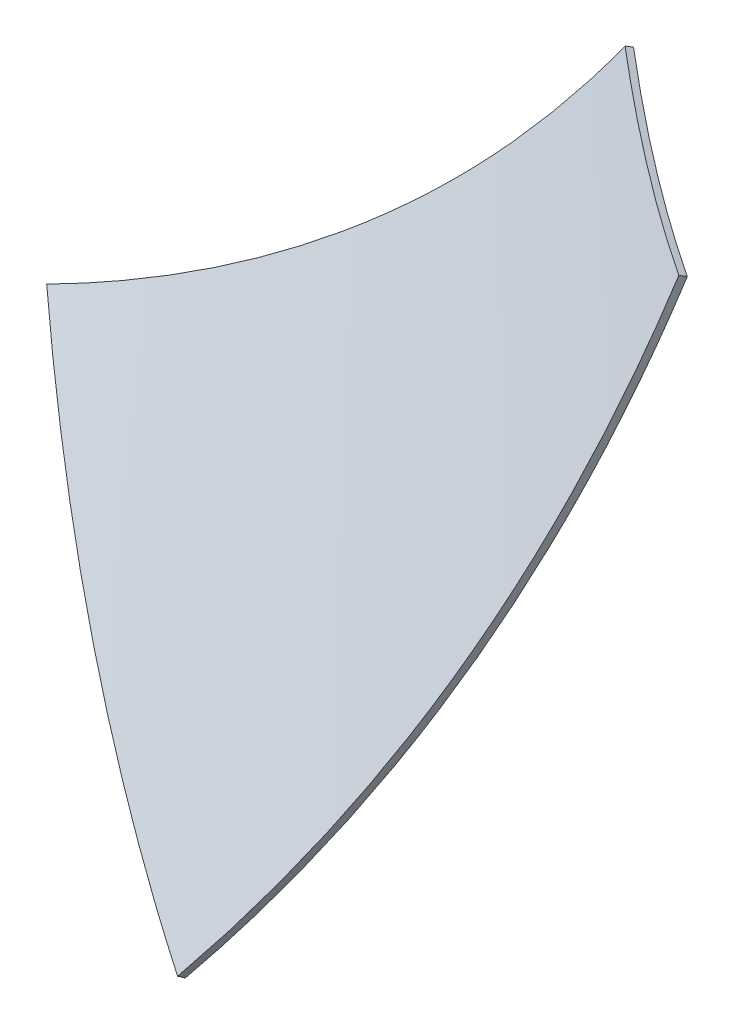
ISO-10303-21;
HEADER;
FILE_DESCRIPTION(('STEP AP214'),'2;1');
FILE_NAME('part.step','',(''),(''),'','','');
FILE_SCHEMA(('AUTOMOTIVE_DESIGN { 1 0 10303 214 1 1 1 1 }'));
ENDSEC;
DATA;
#1=APPLICATION_CONTEXT('core data for automotive mechanical design processes');
#2=APPLICATION_PROTOCOL_DEFINITION('international standard','automotive_design',2000,#1);
#3=PRODUCT_CONTEXT('',#1,'mechanical');
#4=PRODUCT('Part','Part','',(#3));
#5=PRODUCT_RELATED_PRODUCT_CATEGORY('part','',(#4));
#6=PRODUCT_DEFINITION_FORMATION('','',#4);
#7=PRODUCT_DEFINITION_CONTEXT('part definition',#1,'design');
#8=PRODUCT_DEFINITION('design','',#6,#7);
#9=PRODUCT_DEFINITION_SHAPE('','',#8);
#10=(LENGTH_UNIT() NAMED_UNIT(*) SI_UNIT(.MILLI.,.METRE.));
#11=(NAMED_UNIT(*) PLANE_ANGLE_UNIT() SI_UNIT($,.RADIAN.));
#12=(NAMED_UNIT(*) SI_UNIT($,.STERADIAN.) SOLID_ANGLE_UNIT());
#13=UNCERTAINTY_MEASURE_WITH_UNIT(LENGTH_MEASURE(1.E-05),#10,'distance_accuracy_value','');
#14=(GEOMETRIC_REPRESENTATION_CONTEXT(3) GLOBAL_UNCERTAINTY_ASSIGNED_CONTEXT((#13)) GLOBAL_UNIT_ASSIGNED_CONTEXT((#10,
#11,#12)) REPRESENTATION_CONTEXT('',''));
#15=CARTESIAN_POINT('',(0.,0.,0.));
#16=DIRECTION('',(0.,0.,1.));
#17=DIRECTION('',(1.,0.,0.));
#18=AXIS2_PLACEMENT_3D('',#15,#16,#17);
#19=CARTESIAN_POINT('',(79.3770620693268,-120.457408696186,-2.70380006520977));
#20=DIRECTION('',(0.,0.,1.));
#21=DIRECTION('',(1.,0.,0.));
#22=AXIS2_PLACEMENT_3D('',#19,#20,#21);
#23=CONICAL_SURFACE('',#22,60.5897364806192,0.959931088596881);
#24=CARTESIAN_POINT('',(113.763081469682,-170.252399378525,-2.75685890943693));
#25=CARTESIAN_POINT('',(113.8430518673,-170.147553226222,-2.78545030829985));
#26=CARTESIAN_POINT('',(113.922638237613,-170.042424118903,-2.81408465073563));
#27=CARTESIAN_POINT('',(114.318672246614,-169.515340807352,-2.95747724998606));
#28=CARTESIAN_POINT('',(114.629336126704,-169.089190989341,-3.07286604267168));
#29=CARTESIAN_POINT('',(115.238135589453,-168.228364243198,-3.3048713136112));
#30=CARTESIAN_POINT('',(115.536271185896,-167.793687324448,-3.42148779051405));
#31=CARTESIAN_POINT('',(115.973913326075,-167.135596549584,-3.59725895521188));
#32=CARTESIAN_POINT('',(116.118195312454,-166.915228694699,-3.6559882199329));
#33=CARTESIAN_POINT('',(116.546266363469,-166.251090055909,-3.83260339336913));
#34=CARTESIAN_POINT('',(116.825258571065,-165.804316200761,-3.950908096242));
#35=CARTESIAN_POINT('',(117.233941283471,-165.128499931806,-4.12913846131918));
#36=CARTESIAN_POINT('',(117.368529812045,-164.902293695322,-4.1886752614484));
#37=CARTESIAN_POINT('',(117.76739300747,-164.220839546473,-4.36768415576944));
#38=CARTESIAN_POINT('',(118.026744646978,-163.762789241636,-4.48754599459793));
#39=CARTESIAN_POINT('',(118.405698387934,-163.07045794629,-4.66807117115203));
#40=CARTESIAN_POINT('',(118.530332938172,-162.83881351394,-4.72836606275916));
#41=CARTESIAN_POINT('',(118.899179733259,-162.141243595915,-4.90963903164382));
#42=CARTESIAN_POINT('',(119.138315721323,-161.672715747896,-5.03099644120889));
#43=CARTESIAN_POINT('',(119.602887158708,-160.729161916329,-5.2746170729663));
#44=CARTESIAN_POINT('',(119.82832262377,-160.254135940249,-5.39688029411775));
#45=CARTESIAN_POINT('',(120.265424442291,-159.297987378551,-5.64218386217166));
#46=CARTESIAN_POINT('',(120.477090810951,-158.816864799666,-5.76522420821601));
#47=CARTESIAN_POINT('',(120.886544500777,-157.848921516904,-6.01197684195802));
#48=CARTESIAN_POINT('',(121.084331831752,-157.362100817056,-6.1356891291807));
#49=CARTESIAN_POINT('',(121.465908634434,-156.383150548121,-6.38369279603589));
#50=CARTESIAN_POINT('',(121.649698110666,-155.891020980752,-6.50798417548113));
#51=CARTESIAN_POINT('',(122.003141847253,-154.901836426581,-6.75706932986693));
#52=CARTESIAN_POINT('',(122.172796106906,-154.404781439534,-6.88186310483245));
#53=CARTESIAN_POINT('',(122.497815933465,-153.406134318472,-7.13188715657969));
#54=CARTESIAN_POINT('',(122.653181494433,-152.90454218257,-7.25711743354279));
#55=CARTESIAN_POINT('',(123.042825399305,-151.579703796055,-7.58703760967359));
#56=CARTESIAN_POINT('',(123.265115856756,-150.752999236604,-7.79205746416147));
#57=CARTESIAN_POINT('',(123.467814965555,-149.921541777585,-7.99752302693609));
#58=B_SPLINE_CURVE_WITH_KNOTS('',3,(#24,#25,#26,#27,#28,#29,#30,#31,#32,#33,#34,#35,#36,#37,#38,
#39,#40,#41,#42,#43,#44,#45,#46,#47,#48,#49,#50,#51,#52,#53,#54,#55,#56,#57),.UNSPECIFIED.,.F.,
.F.,(4,2,2,2,2,2,2,2,2,2,2,2,2,2,2,2,4),(0.,0.404785694458848,2.02408022212782,3.64337296798241,
4.45295916654202,6.0722507598128,6.88183693229789,8.50112903475456,9.31071537887729,
10.9300091596147,12.5493010798563,14.1685912123174,15.7878802002389,17.4071686645632,
19.026457209355,20.645746427124,23.2857190585913),.UNSPECIFIED.);
#59=CARTESIAN_POINT('',(113.763081469682,-170.252399378525,-2.75685890943708));
#60=VERTEX_POINT('',#59);
#61=CARTESIAN_POINT('',(123.467814965555,-149.921541777585,-7.99752302693618));
#62=VERTEX_POINT('',#61);
#63=EDGE_CURVE('E24',#60,#62,#58,.T.);
#64=ORIENTED_EDGE('',*,*,#63,.T.);
#65=CARTESIAN_POINT('',(123.467814965555,-149.921541777585,-7.99752302693669));
#66=CARTESIAN_POINT('',(123.353900189966,-149.909842691241,-8.06839270908305));
#67=CARTESIAN_POINT('',(123.240281264311,-149.896828156965,-8.1395459575311));
#68=CARTESIAN_POINT('',(122.67345000736,-149.825244410873,-8.49686090490802));
#69=CARTESIAN_POINT('',(122.225035982832,-149.747237864084,-8.78704423252765));
#70=CARTESIAN_POINT('',(121.524058540002,-149.592776207494,-9.25266430869062));
#71=CARTESIAN_POINT('',(121.267148956523,-149.529005516926,-9.42595602925684));
#72=CARTESIAN_POINT('',(120.904386257253,-149.42887855706,-9.67445744911162));
#73=CARTESIAN_POINT('',(120.796500405364,-149.397806276243,-9.74885104371593));
#74=CARTESIAN_POINT('',(120.31886010103,-149.254501487771,-10.0804026850163));
#75=CARTESIAN_POINT('',(119.954072479417,-149.129660688819,-10.3394946224093));
#76=CARTESIAN_POINT('',(119.491680140605,-148.951496900892,-10.6757424971138));
#77=CARTESIAN_POINT('',(119.388219086343,-148.910309152605,-10.7514987942416));
#78=CARTESIAN_POINT('',(118.937843595953,-148.72518493385,-11.0835807574499));
#79=CARTESIAN_POINT('',(118.596666951652,-148.569677711871,-11.341189489594));
#80=CARTESIAN_POINT('',(118.262288373812,-148.401613411912,-11.5999996128499));
#81=B_SPLINE_CURVE_WITH_KNOTS('',3,(#65,#66,#67,#68,#69,#70,#71,#72,#73,#74,#75,#76,#77,#78,#79,
#80),.UNSPECIFIED.,.F.,.F.,(4,2,2,2,2,2,2,4),(0.,0.40403996720341,2.02138933714337,
2.97026784667439,3.37430460638573,4.76665393129968,5.17069019074733,6.53488990231716),.UNSPECIFIED.);
#82=CARTESIAN_POINT('',(118.262288371748,-148.401613410875,-11.5999996144474));
#83=VERTEX_POINT('',#82);
#84=EDGE_CURVE('E119',#62,#83,#81,.T.);
#85=ORIENTED_EDGE('',*,*,#84,.T.);
#86=CARTESIAN_POINT('',(118.262288370097,-148.401613409262,-11.5999996160449));
#87=CARTESIAN_POINT('',(118.182753887889,-148.512288278072,-11.599999649466));
#88=CARTESIAN_POINT('',(118.102739475037,-148.622621200166,-11.6000047399863));
#89=CARTESIAN_POINT('',(117.700242607818,-149.172616884433,-11.6000530761269));
#90=CARTESIAN_POINT('',(117.37061825379,-149.607087354564,-11.6001649766074));
#91=CARTESIAN_POINT('',(116.696639461989,-150.464425619229,-11.6004735845135));
#92=CARTESIAN_POINT('',(116.352285043638,-150.88729342906,-11.6006702918273));
#93=CARTESIAN_POINT('',(115.649296872419,-151.720993623201,-11.6010958966155));
#94=CARTESIAN_POINT('',(115.290663135412,-152.13182602088,-11.6013247940541));
#95=CARTESIAN_POINT('',(114.559588570082,-152.941008315852,-11.6017712994756));
#96=CARTESIAN_POINT('',(114.187147754107,-153.339358224309,-11.6019889074686));
#97=CARTESIAN_POINT('',(113.428912531759,-154.123159087817,-11.6023789968131));
#98=CARTESIAN_POINT('',(113.043118134354,-154.50861005153,-11.602551478195));
#99=CARTESIAN_POINT('',(112.454821987066,-155.076740683179,-11.6027589088286));
#100=CARTESIAN_POINT('',(112.257133514089,-155.264433333524,-11.602819501901));
#101=CARTESIAN_POINT('',(111.659272301795,-155.822489506487,-11.6029726866687));
#102=CARTESIAN_POINT('',(111.254345471927,-156.187789587219,-11.6030366646341));
#103=CARTESIAN_POINT('',(110.432341933911,-156.904425773263,-11.6030799623009));
#104=CARTESIAN_POINT('',(110.015265226958,-157.255761879948,-11.6030592820106));
#105=CARTESIAN_POINT('',(109.169412234273,-157.944086039207,-11.6029358242956));
#106=CARTESIAN_POINT('',(108.740635946982,-158.281074089868,-11.60283304686));
#107=CARTESIAN_POINT('',(108.089126378166,-158.775442272023,-11.6026274061345));
#108=CARTESIAN_POINT('',(107.870577701758,-158.938370845746,-11.602550285689));
#109=CARTESIAN_POINT('',(107.210759103324,-159.421594104367,-11.6022970817997));
#110=CARTESIAN_POINT('',(106.765363231954,-159.736289685787,-11.6020991678254));
#111=CARTESIAN_POINT('',(105.864119781535,-160.350310426863,-11.601673338751));
#112=CARTESIAN_POINT('',(105.408272195112,-160.649635575672,-11.6014454236298));
#113=CARTESIAN_POINT('',(104.486597916203,-161.232539861294,-11.6009981951409));
#114=CARTESIAN_POINT('',(104.02077121446,-161.516118983499,-11.6007788817812));
#115=CARTESIAN_POINT('',(103.314997386127,-161.929345894712,-11.6004924206067));
#116=CARTESIAN_POINT('',(103.078580298202,-162.065057464052,-11.6004040220398));
#117=CARTESIAN_POINT('',(102.239892611252,-162.536956294669,-11.6001296377121));
#118=CARTESIAN_POINT('',(101.631408750366,-162.862115762932,-11.6000013307997));
#119=CARTESIAN_POINT('',(101.015987083845,-163.17387303635,-11.5999996160447));
#120=B_SPLINE_CURVE_WITH_KNOTS('',3,(#86,#87,#88,#89,#90,#91,#92,#93,#94,#95,#96,#97,#98,#99,
#100,#101,#102,#103,#104,#105,#106,#107,#108,#109,#110,#111,#112,#113,#114,#115,#116,#117,#118,
#119),.UNSPECIFIED.,.F.,.F.,(4,2,2,2,2,2,2,2,2,2,2,2,2,2,2,2,4),(0.,0.408872020819142,
2.04458807101605,3.68030196450202,5.31601404100926,6.95172465454628,8.58743416966696,
9.4052000732114,11.0409086396378,12.676617045326,14.3123256691817,15.1300915990263,
16.765801256937,18.4015120690911,20.0372243986585,20.8549909243362,22.9242005441198),.UNSPECIFIED.);
#121=CARTESIAN_POINT('',(101.015987075842,-163.173873052336,-11.5999996085915));
#122=VERTEX_POINT('',#121);
#123=EDGE_CURVE('E69',#83,#122,#120,.T.);
#124=ORIENTED_EDGE('',*,*,#123,.T.);
#125=CARTESIAN_POINT('',(101.01598706784,-163.173873068322,-11.5999996011382));
#126=CARTESIAN_POINT('',(101.10213967104,-163.247213914791,-11.5269277909125));
#127=CARTESIAN_POINT('',(101.188651697364,-163.320200661981,-11.4539216182088));
#128=CARTESIAN_POINT('',(101.449288350244,-163.538081641681,-11.2350973331343));
#129=CARTESIAN_POINT('',(101.62450019393,-163.681885029818,-11.0894849009645));
#130=CARTESIAN_POINT('',(101.889539429796,-163.895305103292,-10.8715024183873));
#131=CARTESIAN_POINT('',(101.978262317309,-163.966069121625,-10.7989092655171));
#132=CARTESIAN_POINT('',(102.156448454248,-164.106820093573,-10.6538736330072));
#133=CARTESIAN_POINT('',(102.245911717392,-164.176807032732,-10.5814311561903));
#134=CARTESIAN_POINT('',(102.515870748243,-164.385898047141,-10.3639905886562));
#135=CARTESIAN_POINT('',(102.697505592841,-164.523785588036,-10.2192333219062));
#136=CARTESIAN_POINT('',(103.063644803285,-164.796377454159,-9.9303428789444));
#137=CARTESIAN_POINT('',(103.248149256897,-164.931081681708,-9.7862097219938));
#138=CARTESIAN_POINT('',(103.619727290917,-165.197543241606,-9.49848878595271));
#139=CARTESIAN_POINT('',(103.80680108841,-165.329300322447,-9.35490105427007));
#140=CARTESIAN_POINT('',(104.183646649267,-165.589604406084,-9.06835822748305));
#141=CARTESIAN_POINT('',(104.373418395412,-165.718151429354,-8.92540312834843));
#142=CARTESIAN_POINT('',(104.755729041549,-165.971844700257,-8.64018380184845));
#143=CARTESIAN_POINT('',(104.948267887557,-166.0969910141,-8.49791956107695));
#144=CARTESIAN_POINT('',(105.336118702056,-166.343758980223,-8.2141186991131));
#145=CARTESIAN_POINT('',(105.531430693357,-166.465380603488,-8.07258208391865));
#146=CARTESIAN_POINT('',(106.121366219435,-166.824885712586,-7.64910636747728));
#147=CARTESIAN_POINT('',(106.520045618842,-167.057446815144,-7.36825940015421));
#148=CARTESIAN_POINT('',(107.125036366537,-167.395317884549,-6.94955122240342));
#149=CARTESIAN_POINT('',(107.327613692855,-167.505986411244,-6.81057474662503));
#150=CARTESIAN_POINT('',(107.735157183996,-167.723740040631,-6.53337574629982));
#151=CARTESIAN_POINT('',(107.940123073188,-167.830825551378,-6.39515313740928));
#152=CARTESIAN_POINT('',(108.558547523372,-168.146691008523,-5.98159275917938));
#153=CARTESIAN_POINT('',(108.975523470122,-168.350074632964,-5.70736893782584));
#154=CARTESIAN_POINT('',(109.818358185782,-168.742068876054,-5.16201780946631));
#155=CARTESIAN_POINT('',(110.244216975134,-168.930679460704,-4.89089050958808));
#156=CARTESIAN_POINT('',(110.889324919595,-169.202096725689,-4.48668174301013));
#157=CARTESIAN_POINT('',(111.105403331259,-169.290648609094,-4.35236577856414));
#158=CARTESIAN_POINT('',(111.722193362917,-169.53666408063,-3.97199687180547));
#159=CARTESIAN_POINT('',(112.12539662877,-169.689470716393,-3.72694462803142));
#160=CARTESIAN_POINT('',(112.939001000267,-169.981404664708,-3.23966292525212));
#161=CARTESIAN_POINT('',(113.349408868768,-170.120518214642,-2.99743651762216));
#162=CARTESIAN_POINT('',(113.763081469682,-170.252399378524,-2.75685890943715));
#163=B_SPLINE_CURVE_WITH_KNOTS('',3,(#125,#126,#127,#128,#129,#130,#131,#132,#133,#134,#135,
#136,#137,#138,#139,#140,#141,#142,#143,#144,#145,#146,#147,#148,#149,#150,#151,#152,#153,#154,
#155,#156,#157,#158,#159,#160,#161,#162),.UNSPECIFIED.,.F.,.F.,(4,2,2,2,2,2,2,2,2,2,2,2,2,2,2,2,
2,2,4),(0.,0.404064074442537,1.21225540148506,1.61640712939937,2.02056636196614,
2.83085307733493,3.64116462404044,4.45154506054309,5.26192032698395,6.0722798046909,
6.88264595161094,8.50313964400115,9.31144150714358,10.1196510006726,11.7361076877805,
13.3525680949926,14.1607182148734,15.6483269535309,17.1374159062851),.UNSPECIFIED.);
#164=EDGE_CURVE('E66',#122,#60,#163,.T.);
#165=ORIENTED_EDGE('',*,*,#164,.T.);
#166=EDGE_LOOP('',(#64,#85,#124,#165));
#167=FACE_BOUND('',#166,.T.);
#168=ADVANCED_FACE('F17',(#167),#23,.F.);
#169=CARTESIAN_POINT('',(123.564147396007,-149.985916989266,-8.16299173988277));
#170=CARTESIAN_POINT('',(123.563829467194,-149.985704529822,-8.16244563851991));
#171=CARTESIAN_POINT('',(123.56351153838,-149.985492070377,-8.16189953715705));
#172=CARTESIAN_POINT('',(123.563193609567,-149.985279610933,-8.16135343579419));
#173=CARTESIAN_POINT('',(123.53140072823,-149.964033666484,-8.10674329950825));
#174=CARTESIAN_POINT('',(123.499607846893,-149.942787722035,-8.05213316322232));
#175=CARTESIAN_POINT('',(123.467814965555,-149.921541777585,-7.99752302693639));
#176=CARTESIAN_POINT('',(122.538214663124,-154.181729638401,-7.12789737510282));
#177=CARTESIAN_POINT('',(122.537912965959,-154.18149288177,-7.12735127373996));
#178=CARTESIAN_POINT('',(122.537611268795,-154.181256125138,-7.1268051723771));
#179=CARTESIAN_POINT('',(122.53730957163,-154.181019368507,-7.12625907101424));
#180=CARTESIAN_POINT('',(122.507139855162,-154.157343705376,-7.07164893472831));
#181=CARTESIAN_POINT('',(122.476968148346,-154.133673361804,-7.01703879844238));
#182=CARTESIAN_POINT('',(122.446798431878,-154.109997698673,-6.96242866215644));
#183=CARTESIAN_POINT('',(119.850629883602,-161.377892276661,-5.31572076843104));
#184=CARTESIAN_POINT('',(119.850360535575,-161.377617707097,-5.31517466706818));
#185=CARTESIAN_POINT('',(119.850091187547,-161.377343137534,-5.31462856570532));
#186=CARTESIAN_POINT('',(119.84982183952,-161.377068567971,-5.31408246434246));
#187=CARTESIAN_POINT('',(119.822887036781,-161.349611611655,-5.25947232805653));
#188=CARTESIAN_POINT('',(119.79595325842,-161.322152611605,-5.20486219177059));
#189=CARTESIAN_POINT('',(119.769018455681,-161.294695655289,-5.15025205548466));
#190=CARTESIAN_POINT('',(115.774616684326,-167.799786483325,-3.61624611019745));
#191=CARTESIAN_POINT('',(115.77438357966,-167.79948275581,-3.61570000883459));
#192=CARTESIAN_POINT('',(115.774150474993,-167.799179028294,-3.61515390747173));
#193=CARTESIAN_POINT('',(115.773917370327,-167.798875300779,-3.61460780610887));
#194=CARTESIAN_POINT('',(115.750606903698,-167.768502549242,-3.55999766982294));
#195=CARTESIAN_POINT('',(115.727295990831,-167.738130482173,-3.505387533537));
#196=CARTESIAN_POINT('',(115.703985524202,-167.707757730636,-3.45077739725107));
#197=CARTESIAN_POINT('',(113.828918312539,-170.347738851769,-2.92232762238331));
#198=CARTESIAN_POINT('',(113.82870102923,-170.347424200042,-2.92178152102045));
#199=CARTESIAN_POINT('',(113.82848374592,-170.347109548315,-2.92123541965759));
#200=CARTESIAN_POINT('',(113.82826646261,-170.346794896588,-2.92068931829473));
#201=CARTESIAN_POINT('',(113.806538131634,-170.315329723901,-2.86607918200879));
#202=CARTESIAN_POINT('',(113.784809800658,-170.283864551213,-2.81146904572286));
#203=CARTESIAN_POINT('',(113.763081469682,-170.252399378525,-2.75685890943693));
#204=B_SPLINE_SURFACE_WITH_KNOTS('',3,3,((#169,#170,#171,#172,#173,#174,#175),(#176,#177,#178,
#179,#180,#181,#182),(#183,#184,#185,#186,#187,#188,#189),(#190,#191,#192,#193,#194,#195,#196),
(#197,#198,#199,#200,#201,#202,#203)),.UNSPECIFIED.,.F.,.F.,.F.,(4,1,4),(4,3,4),(0.,
0.571428571428571,1.),(-0.01,0.,1.),.UNSPECIFIED.);
#205=DIRECTION('',(-0.47689322005696,0.318689166736303,0.819152044292526));
#206=VECTOR('',#205,1.);
#207=CARTESIAN_POINT('',(123.515027394341,-149.953092005093,-8.07861907932101));
#208=LINE('',#207,#206);
#209=CARTESIAN_POINT('',(123.560981372696,-149.98380197679,-8.15755361789359));
#210=VERTEX_POINT('',#209);
#211=EDGE_CURVE('E78',#210,#62,#208,.T.);
#212=DIRECTION('',(0.325924964639684,-0.471977590319812,-0.819152044287582));
#213=VECTOR('',#212,1.);
#214=CARTESIAN_POINT('',(113.795673966146,-170.299597137556,-2.83877411386612));
#215=LINE('',#214,#213);
#216=CARTESIAN_POINT('',(113.828266471113,-170.34679489929,-2.92068931335497));
#217=VERTEX_POINT('',#216);
#218=EDGE_CURVE('E73',#60,#217,#215,.T.);
#219=CARTESIAN_POINT('',(123.560981222018,-149.983802593703,-8.15755346593909));
#220=CARTESIAN_POINT('',(123.530154280135,-150.110016309884,-8.126465296076));
#221=CARTESIAN_POINT('',(123.4988750555,-150.236123526272,-8.09538663065028));
#222=CARTESIAN_POINT('',(123.340213965111,-150.86615585829,-7.94003116136122));
#223=CARTESIAN_POINT('',(123.206070199982,-151.368433198176,-7.81590154625642));
#224=CARTESIAN_POINT('',(122.923559393301,-152.369045701561,-7.56799565189006));
#225=CARTESIAN_POINT('',(122.775192366086,-152.867380869033,-7.44421937227249));
#226=CARTESIAN_POINT('',(122.464402084239,-153.859754793862,-7.1970571626321));
#227=CARTESIAN_POINT('',(122.30197883894,-154.353793554072,-7.07367123235019));
#228=CARTESIAN_POINT('',(121.963242882735,-155.337175203973,-6.82735325732882));
#229=CARTESIAN_POINT('',(121.78693017625,-155.82651809516,-6.70442121244495));
#230=CARTESIAN_POINT('',(121.237210270667,-157.287365111338,-6.33629920127542));
#231=CARTESIAN_POINT('',(120.843109492057,-158.251406007429,-6.09185345400731));
#232=CARTESIAN_POINT('',(120.211519790234,-159.679695112397,-5.72736315599608));
#233=CARTESIAN_POINT('',(119.994283642515,-160.152763933826,-5.60624638241367));
#234=CARTESIAN_POINT('',(119.546368563673,-161.092740128025,-5.36481453308738));
#235=CARTESIAN_POINT('',(119.315689617228,-161.559647493771,-5.24449945825751));
#236=CARTESIAN_POINT('',(118.95967864535,-162.255016521535,-5.06474282664065));
#237=CARTESIAN_POINT('',(118.839347414402,-162.485965957585,-5.00494542249797));
#238=CARTESIAN_POINT('',(118.473362849884,-163.176326244654,-4.82589756185726));
#239=CARTESIAN_POINT('',(118.222735372608,-163.633215219105,-4.70700017952563));
#240=CARTESIAN_POINT('',(117.83708699722,-164.313158488517,-4.52939928027037));
#241=CARTESIAN_POINT('',(117.706924593348,-164.538899760804,-4.47032531293458));
#242=CARTESIAN_POINT('',(117.047845972874,-165.663439791196,-4.17547129850266));
#243=CARTESIAN_POINT('',(116.494681239695,-166.548756782488,-3.94149507088349));
#244=CARTESIAN_POINT('',(115.584842089683,-167.917051343436,-3.57668812860339));
#245=CARTESIAN_POINT('',(115.244801581219,-168.410822344596,-3.4443619240422));
#246=CARTESIAN_POINT('',(114.548585497672,-169.387253503822,-3.18130298403446));
#247=CARTESIAN_POINT('',(114.192410650806,-169.869914161871,-3.05057017700776));
#248=CARTESIAN_POINT('',(113.828266496208,-170.34679485259,-2.92068933027753));
#249=B_SPLINE_CURVE_WITH_KNOTS('',3,(#219,#220,#221,#222,#223,#224,#225,#226,#227,#228,#229,
#230,#231,#232,#233,#234,#235,#236,#237,#238,#239,#240,#241,#242,#243,#244,#245,#246,#247,#248),
.UNSPECIFIED.,.F.,.F.,(4,2,2,2,2,2,2,2,2,2,2,2,2,2,4),(0.,0.400777815185843,2.00403349609063,
3.60728756108615,5.21054056172103,6.81379305214154,10.021206705522,11.6244610875558,
13.2277172971304,14.0292876063168,15.632544459942,16.4341145352131,19.6415503944249,
21.4831713043961,23.3247091760947),.UNSPECIFIED.);
#250=EDGE_CURVE('E113',#210,#217,#249,.T.);
#251=ORIENTED_EDGE('',*,*,#211,.T.);
#252=ORIENTED_EDGE('',*,*,#63,.F.);
#253=ORIENTED_EDGE('',*,*,#218,.T.);
#254=ORIENTED_EDGE('',*,*,#250,.F.);
#255=EDGE_LOOP('',(#251,#252,#253,#254));
#256=FACE_BOUND('',#255,.T.);
#257=ADVANCED_FACE('F75',(#256),#204,.F.);
#258=CARTESIAN_POINT('',(113.828918312539,-170.347738851769,-2.92232762238351));
#259=CARTESIAN_POINT('',(113.82870102923,-170.347424200042,-2.92178152102065));
#260=CARTESIAN_POINT('',(113.82848374592,-170.347109548315,-2.92123541965779));
#261=CARTESIAN_POINT('',(113.82826646261,-170.346794896588,-2.92068931829493));
#262=CARTESIAN_POINT('',(113.806538131634,-170.3153297239,-2.86607918200905));
#263=CARTESIAN_POINT('',(113.784809800658,-170.283864551212,-2.81146904572318));
#264=CARTESIAN_POINT('',(113.763081469682,-170.252399378524,-2.7568589094373));
#265=CARTESIAN_POINT('',(113.762862013539,-170.25208158028,-2.75630734706081));
#266=CARTESIAN_POINT('',(113.762642557396,-170.251763782036,-2.75575578468432));
#267=CARTESIAN_POINT('',(113.762423101253,-170.251445983792,-2.75520422230784));
#268=CARTESIAN_POINT('',(111.011640191934,-169.452586240106,-4.55903629348518));
#269=CARTESIAN_POINT('',(111.011432302264,-169.452265094955,-4.55849019212232));
#270=CARTESIAN_POINT('',(111.011224412594,-169.451943949804,-4.55794409075946));
#271=CARTESIAN_POINT('',(111.011016522924,-169.451622804653,-4.5573979893966));
#272=CARTESIAN_POINT('',(110.990227555935,-169.419508289542,-4.50278785311072));
#273=CARTESIAN_POINT('',(110.969437879601,-169.387396253123,-4.44817771682482));
#274=CARTESIAN_POINT('',(110.948648912612,-169.355281738012,-4.39356758053894));
#275=CARTESIAN_POINT('',(110.948438944045,-169.354957381409,-4.39301601816245));
#276=CARTESIAN_POINT('',(110.948228975479,-169.354633024807,-4.39246445578597));
#277=CARTESIAN_POINT('',(110.948019006912,-169.354308668204,-4.39191289340948));
#278=CARTESIAN_POINT('',(107.370811353188,-167.766381214528,-6.90068231456786));
#279=CARTESIAN_POINT('',(107.370616016257,-167.766052288026,-6.900136213205));
#280=CARTESIAN_POINT('',(107.370420679327,-167.765723361523,-6.89959011184214));
#281=CARTESIAN_POINT('',(107.370225342396,-167.765394435021,-6.89904401047928));
#282=CARTESIAN_POINT('',(107.350691649346,-167.732501784796,-6.84443387419337));
#283=CARTESIAN_POINT('',(107.331156665367,-167.699609914855,-6.78982373790748));
#284=CARTESIAN_POINT('',(107.311622972318,-167.66671726463,-6.73521360162157));
#285=CARTESIAN_POINT('',(107.311425682018,-167.666385048863,-6.73466203924508));
#286=CARTESIAN_POINT('',(107.311228391718,-167.666052833095,-6.73411047686859));
#287=CARTESIAN_POINT('',(107.311031101419,-167.665720617328,-6.73355891449211));
#288=CARTESIAN_POINT('',(104.063384770749,-165.592783746403,-9.35521788359511));
#289=CARTESIAN_POINT('',(104.063201194589,-165.592448288513,-9.35467178223225));
#290=CARTESIAN_POINT('',(104.06301761843,-165.592112830623,-9.35412568086939));
#291=CARTESIAN_POINT('',(104.06283404227,-165.591777372732,-9.35357957950653));
#292=CARTESIAN_POINT('',(104.044476426295,-165.558231583683,-9.29896944322062));
#293=CARTESIAN_POINT('',(104.026121261038,-165.524684245441,-9.2443593069347));
#294=CARTESIAN_POINT('',(104.007763645063,-165.491138456392,-9.18974917064879));
#295=CARTESIAN_POINT('',(104.007578233142,-165.490799643923,-9.1891976082723));
#296=CARTESIAN_POINT('',(104.00739282122,-165.490460831453,-9.18864604589582));
#297=CARTESIAN_POINT('',(104.007207409299,-165.490122018984,-9.18809448351933));
#298=CARTESIAN_POINT('',(102.402852539726,-164.374073519232,-10.6558024227853));
#299=CARTESIAN_POINT('',(102.40267493503,-164.373734867805,-10.6552563214224));
#300=CARTESIAN_POINT('',(102.402497330334,-164.373396216378,-10.6547102200596));
#301=CARTESIAN_POINT('',(102.402319725638,-164.373057564951,-10.6541641186967));
#302=CARTESIAN_POINT('',(102.384559256025,-164.339192422252,-10.5995539824107));
#303=CARTESIAN_POINT('',(102.366796156755,-164.305329130812,-10.5449438461248));
#304=CARTESIAN_POINT('',(102.349035687142,-164.271463988114,-10.4903337098389));
#305=CARTESIAN_POINT('',(102.348856306399,-164.271121950173,-10.4897821474624));
#306=CARTESIAN_POINT('',(102.348676925656,-164.270779912231,-10.4892305850859));
#307=CARTESIAN_POINT('',(102.348497544913,-164.27043787429,-10.4886790227094));
#308=CARTESIAN_POINT('',(101.59754310817,-163.726943120292,-11.3171126533402));
#309=CARTESIAN_POINT('',(101.597368385191,-163.726602983727,-11.3165665519773));
#310=CARTESIAN_POINT('',(101.597193662212,-163.726262847162,-11.3160204506145));
#311=CARTESIAN_POINT('',(101.597018939233,-163.725922710597,-11.3154743492516));
#312=CARTESIAN_POINT('',(101.579546641338,-163.691909054112,-11.2608642129657));
#313=CARTESIAN_POINT('',(101.562078562151,-163.65789264366,-11.2062540766797));
#314=CARTESIAN_POINT('',(101.544606264256,-163.623878987175,-11.1516439403938));
#315=CARTESIAN_POINT('',(101.544429794047,-163.623535449245,-11.1510923780173));
#316=CARTESIAN_POINT('',(101.544253323839,-163.623191911314,-11.1505408156408));
#317=CARTESIAN_POINT('',(101.54407685363,-163.622848373384,-11.1499892532643));
#318=CARTESIAN_POINT('',(101.068344954881,-163.277230498289,-11.7654683091632));
#319=CARTESIAN_POINT('',(101.068172156593,-163.276889384675,-11.7649222078003));
#320=CARTESIAN_POINT('',(101.067999358305,-163.276548271061,-11.7643761064375));
#321=CARTESIAN_POINT('',(101.067826560017,-163.276207157447,-11.7638300050746));
#322=CARTESIAN_POINT('',(101.050546731225,-163.242095796052,-11.7092198687886));
#323=CARTESIAN_POINT('',(101.033266902433,-163.207984434657,-11.6546097325027));
#324=CARTESIAN_POINT('',(101.015987073642,-163.173873073262,-11.5999995962168));
#325=CARTESIAN_POINT('',(101.015812547371,-163.173528548512,-11.5994480338403));
#326=CARTESIAN_POINT('',(101.0156380211,-163.173184023762,-11.5988964714638));
#327=CARTESIAN_POINT('',(101.01546349483,-163.172839499012,-11.5983449090873));
#328=B_SPLINE_SURFACE_WITH_KNOTS('',3,3,((#258,#259,#260,#261,#262,#263,#264,#265,#266,#267),
(#268,#269,#270,#271,#272,#273,#274,#275,#276,#277),(#278,#279,#280,#281,#282,#283,#284,#285,
#286,#287),(#288,#289,#290,#291,#292,#293,#294,#295,#296,#297),(#298,#299,#300,#301,#302,#303,
#304,#305,#306,#307),(#308,#309,#310,#311,#312,#313,#314,#315,#316,#317),(#318,#319,#320,#321,
#322,#323,#324,#325,#326,#327)),.UNSPECIFIED.,.F.,.F.,.F.,(4,1,1,1,4),(4,3,3,4),(0.,
0.571428571428571,0.785714285714286,0.857142857142857,1.),(-0.01,0.,1.,1.0101),.UNSPECIFIED.);
#329=DIRECTION('',(0.259197432136551,-0.511670420794074,-0.819152044286184));
#330=VECTOR('',#329,1.);
#331=CARTESIAN_POINT('',(101.04236993646,-163.225954228058,-11.6833783341663));
#332=LINE('',#331,#330);
#333=CARTESIAN_POINT('',(101.067670027412,-163.275897907185,-11.7633350556309));
#334=VERTEX_POINT('',#333);
#335=EDGE_CURVE('E84',#122,#334,#332,.T.);
#336=CARTESIAN_POINT('',(113.828266479617,-170.346794901992,-2.92068930841491));
#337=CARTESIAN_POINT('',(113.717080142377,-170.311465209425,-2.98528436382992));
#338=CARTESIAN_POINT('',(113.606128014709,-170.275611215986,-3.04999989226915));
#339=CARTESIAN_POINT('',(113.052491199174,-170.093732369034,-3.37420305985109));
#340=CARTESIAN_POINT('',(112.613363579939,-169.939939201332,-3.63545973106468));
#341=CARTESIAN_POINT('',(111.741910204962,-169.616193539827,-4.16211396149902));
#342=CARTESIAN_POINT('',(111.30960554214,-169.44619933037,-4.42752065462886));
#343=CARTESIAN_POINT('',(110.453268549378,-169.091046054986,-4.96160115626321));
#344=CARTESIAN_POINT('',(110.029236882844,-168.90588577904,-5.23027522399496));
#345=CARTESIAN_POINT('',(109.189876652958,-168.520948052629,-5.77068731235498));
#346=CARTESIAN_POINT('',(108.774547851622,-168.321171002541,-6.04242524888667));
#347=CARTESIAN_POINT('',(107.953060378564,-167.907394779021,-6.58883649363926));
#348=CARTESIAN_POINT('',(107.546900803732,-167.693397014499,-6.86350950881248));
#349=CARTESIAN_POINT('',(106.945503969379,-167.362209085979,-7.2772991563002));
#350=CARTESIAN_POINT('',(106.746610790434,-167.250273779808,-7.41533668163869));
#351=CARTESIAN_POINT('',(106.351294807175,-167.022921193565,-7.69214552399893));
#352=CARTESIAN_POINT('',(106.154872294322,-166.907503508038,-7.83091692490248));
#353=CARTESIAN_POINT('',(105.764615856309,-166.673193666264,-8.10918290870385));
#354=CARTESIAN_POINT('',(105.570782027707,-166.554301380937,-8.2486775183097));
#355=CARTESIAN_POINT('',(105.185805794199,-166.313058431506,-8.52838074652555));
#356=CARTESIAN_POINT('',(104.994663348224,-166.19070782026,-8.66858935419566));
#357=CARTESIAN_POINT('',(104.615084642298,-165.942646426984,-8.94969158637073));
#358=CARTESIAN_POINT('',(104.426648366489,-165.816935664656,-9.09058520685505));
#359=CARTESIAN_POINT('',(104.052449866855,-165.562306961297,-9.37300943757281));
#360=CARTESIAN_POINT('',(103.866687581052,-165.43338909479,-9.51454003294216));
#361=CARTESIAN_POINT('',(103.497673217664,-165.172611415566,-9.79816175821924));
#362=CARTESIAN_POINT('',(103.31442114506,-165.040751597012,-9.94025288923854));
#363=CARTESIAN_POINT('',(102.955077988115,-164.777348518853,-10.2214785969832));
#364=CARTESIAN_POINT('',(102.778922066955,-164.64587866336,-10.3605990021336));
#365=CARTESIAN_POINT('',(102.42941217861,-164.379896019098,-10.6394475512727));
#366=CARTESIAN_POINT('',(102.256058194151,-164.245383249103,-10.7791756915076));
#367=CARTESIAN_POINT('',(101.9119430753,-163.973326466324,-11.0593324919257));
#368=CARTESIAN_POINT('',(101.741184575689,-163.835779680903,-11.1997616937447));
#369=CARTESIAN_POINT('',(101.402392039518,-163.557898610775,-11.4811557429606));
#370=CARTESIAN_POINT('',(101.23435804604,-163.417564282068,-11.6221205987841));
#371=CARTESIAN_POINT('',(101.067670040848,-163.275898067513,-11.7633349512189));
#372=B_SPLINE_CURVE_WITH_KNOTS('',3,(#336,#337,#338,#339,#340,#341,#342,#343,#344,#345,#346,
#347,#348,#349,#350,#351,#352,#353,#354,#355,#356,#357,#358,#359,#360,#361,#362,#363,#364,#365,
#366,#367,#368,#369,#370,#371),.UNSPECIFIED.,.F.,.F.,(4,2,2,2,2,2,2,2,2,2,2,2,2,2,2,2,2,4),(0.,
0.400064412024646,2.0005443437808,3.60526277847462,5.21010937000205,6.81491201867133,
8.41955590860818,9.21970313351652,10.0199438818523,10.8202143965537,11.6204726861722,
12.4207262843951,13.2209613041977,14.0211979116912,14.8015686406549,15.5819345563286,
16.363045856164,17.144169495133),.UNSPECIFIED.);
#373=EDGE_CURVE('E81',#217,#334,#372,.T.);
#374=ORIENTED_EDGE('',*,*,#218,.F.);
#375=ORIENTED_EDGE('',*,*,#164,.F.);
#376=ORIENTED_EDGE('',*,*,#335,.T.);
#377=ORIENTED_EDGE('',*,*,#373,.F.);
#378=EDGE_LOOP('',(#374,#375,#376,#377));
#379=FACE_BOUND('',#378,.T.);
#380=ADVANCED_FACE('F79',(#379),#328,.F.);
#381=CARTESIAN_POINT('',(101.068752645582,-163.278035191079,-11.7667566683326));
#382=CARTESIAN_POINT('',(101.068444001643,-163.277425910451,-11.7657812485077));
#383=CARTESIAN_POINT('',(101.068135357703,-163.276816629822,-11.7648058286827));
#384=CARTESIAN_POINT('',(101.067826713764,-163.276207349194,-11.7638304088578));
#385=CARTESIAN_POINT('',(101.050546884955,-163.242095987808,-11.7092202725719));
#386=CARTESIAN_POINT('',(101.033267056146,-163.207984626422,-11.6546101362859));
#387=CARTESIAN_POINT('',(101.015987227337,-163.173873265037,-11.6));
#388=CARTESIAN_POINT('',(101.01581134261,-163.173526058617,-11.5994441444389));
#389=CARTESIAN_POINT('',(101.015635457882,-163.173178852197,-11.5988882888778));
#390=CARTESIAN_POINT('',(101.015459573155,-163.172831645777,-11.5983324333167));
#391=CARTESIAN_POINT('',(107.902689998498,-159.816160590336,-11.7667566683326));
#392=CARTESIAN_POINT('',(107.90228404979,-159.81560048296,-11.7657812485077));
#393=CARTESIAN_POINT('',(107.901878101081,-159.815040375584,-11.7648058286827));
#394=CARTESIAN_POINT('',(107.901472152373,-159.814480268209,-11.7638304088578));
#395=CARTESIAN_POINT('',(107.878744590639,-159.783121934772,-11.7092202725719));
#396=CARTESIAN_POINT('',(107.856028269049,-159.751777815233,-11.6546101362859));
#397=CARTESIAN_POINT('',(107.833300707315,-159.720419481796,-11.6));
#398=CARTESIAN_POINT('',(107.833069372211,-159.720100297388,-11.5994441444389));
#399=CARTESIAN_POINT('',(107.832838037106,-159.71978111298,-11.5988882888778));
#400=CARTESIAN_POINT('',(107.832606702002,-159.719461928572,-11.5983324333167));
#401=CARTESIAN_POINT('',(113.886491755788,-154.69075591982,-11.7667566683326));
#402=CARTESIAN_POINT('',(113.88600065911,-154.690268745643,-11.7657812485077));
#403=CARTESIAN_POINT('',(113.885509562432,-154.689781571466,-11.7648058286827));
#404=CARTESIAN_POINT('',(113.885018465754,-154.689294397289,-11.7638304088578));
#405=CARTESIAN_POINT('',(113.857523785184,-154.662019322979,-11.7092202725719));
#406=CARTESIAN_POINT('',(113.830041423071,-154.634757538939,-11.6546101362859));
#407=CARTESIAN_POINT('',(113.802546742502,-154.607482464629,-11.6));
#408=CARTESIAN_POINT('',(113.80226688473,-154.607204842144,-11.5994441444389));
#409=CARTESIAN_POINT('',(113.801987026957,-154.606927219659,-11.5988882888778));
#410=CARTESIAN_POINT('',(113.801707169185,-154.606649597174,-11.5983324333167));
#411=CARTESIAN_POINT('',(118.35710823533,-148.469754088306,-11.7667566683326));
#412=CARTESIAN_POINT('',(118.356553601058,-148.469355509846,-11.7657812485077));
#413=CARTESIAN_POINT('',(118.355998966785,-148.468956931385,-11.7648058286827));
#414=CARTESIAN_POINT('',(118.355444332513,-148.468558352924,-11.7638304088578));
#415=CARTESIAN_POINT('',(118.324392417815,-148.446243424001,-11.7092202725719));
#416=CARTESIAN_POINT('',(118.293340503116,-148.423928495078,-11.6546101362859));
#417=CARTESIAN_POINT('',(118.262288588418,-148.401613566155,-11.6));
#418=CARTESIAN_POINT('',(118.261972522928,-148.401386431081,-11.5994441444389));
#419=CARTESIAN_POINT('',(118.261656457439,-148.401159296007,-11.5988882888778));
#420=CARTESIAN_POINT('',(118.261340391949,-148.400932160934,-11.5983324333167));
#421=B_SPLINE_SURFACE_WITH_KNOTS('',3,3,((#381,#382,#383,#384,#385,#386,#387,#388,#389,#390),
(#391,#392,#393,#394,#395,#396,#397,#398,#399,#400),(#401,#402,#403,#404,#405,#406,#407,#408,
#409,#410),(#411,#412,#413,#414,#415,#416,#417,#418,#419,#420)),.UNSPECIFIED.,.F.,.F.,.F.,(4,4),
(4,3,3,4),(0.,1.),(-0.0178615160346553,0.,1.,1.01017861516035),.UNSPECIFIED.);
#422=DIRECTION('',(0.465778720470956,-0.334723933845925,-0.819152044291625));
#423=VECTOR('',#422,1.);
#424=CARTESIAN_POINT('',(118.308400467047,-148.434751081317,-11.6810956653056));
#425=LINE('',#424,#423);
#426=CARTESIAN_POINT('',(118.353651422833,-148.467269920961,-11.76067739961));
#427=VERTEX_POINT('',#426);
#428=EDGE_CURVE('E45',#83,#427,#425,.T.);
#429=CARTESIAN_POINT('',(101.067670081542,-163.275897879771,-11.7633350556403));
#430=CARTESIAN_POINT('',(101.189255929068,-163.214322380577,-11.763355806864));
#431=CARTESIAN_POINT('',(101.310578094627,-163.152220941527,-11.7633809560981));
#432=CARTESIAN_POINT('',(101.915914556673,-162.839065525202,-11.7635263085443));
#433=CARTESIAN_POINT('',(102.395902734055,-162.580168971655,-11.7637052995405));
#434=CARTESIAN_POINT('',(103.346694579737,-162.046062684433,-11.7641272290208));
#435=CARTESIAN_POINT('',(103.817498260064,-161.770852972123,-11.764370167421));
#436=CARTESIAN_POINT('',(104.749425726842,-161.204497918171,-11.7648675373788));
#437=CARTESIAN_POINT('',(105.210549523978,-160.91335259412,-11.7651219689238));
#438=CARTESIAN_POINT('',(106.122604429512,-160.31552287173,-11.7655989597033));
#439=CARTESIAN_POINT('',(106.573535546977,-160.008838487215,-11.7658215189663));
#440=CARTESIAN_POINT('',(107.464725339783,-159.380313465856,-11.7662009936039));
#441=CARTESIAN_POINT('',(107.904984022261,-159.058472839151,-11.7663579090224));
#442=CARTESIAN_POINT('',(108.556938718387,-158.564692201008,-11.7665266172832));
#443=CARTESIAN_POINT('',(108.772839931125,-158.398271350168,-11.7665717419199));
#444=CARTESIAN_POINT('',(109.416327038162,-157.893505529283,-11.7666708248364));
#445=CARTESIAN_POINT('',(109.839648963731,-157.549691970601,-11.7666884745784));
#446=CARTESIAN_POINT('',(110.674386806564,-156.847930986976,-11.7666185410435));
#447=CARTESIAN_POINT('',(111.085802725033,-156.489983563463,-11.7665309577774));
#448=CARTESIAN_POINT('',(111.896281271642,-155.760339548692,-11.7662530006003));
#449=CARTESIAN_POINT('',(112.295343898198,-155.38864295567,-11.7660626266762));
#450=CARTESIAN_POINT('',(112.88425951826,-154.821155180634,-11.7657099629052));
#451=CARTESIAN_POINT('',(113.078941445095,-154.630345987677,-11.7655812332421));
#452=CARTESIAN_POINT('',(113.658142679636,-154.052946165735,-11.7651653301472));
#453=CARTESIAN_POINT('',(114.037774194378,-153.661423573948,-11.7648484640727));
#454=CARTESIAN_POINT('',(114.783485916241,-152.865701642623,-11.7641635520865));
#455=CARTESIAN_POINT('',(115.149566113941,-152.461502294271,-11.7637955061392));
#456=CARTESIAN_POINT('',(115.867733010938,-151.640834734179,-11.7630465624793));
#457=CARTESIAN_POINT('',(116.219819697426,-151.224366511209,-11.7626656647548));
#458=CARTESIAN_POINT('',(116.73705838042,-150.590855300385,-11.7621205348356));
#459=CARTESIAN_POINT('',(116.90764702936,-150.378228605903,-11.7619432032779));
#460=CARTESIAN_POINT('',(117.514675371771,-149.608166861497,-11.7613338814419));
#461=CARTESIAN_POINT('',(117.940567301613,-149.042407098739,-11.7609475150591));
#462=CARTESIAN_POINT('',(118.353650801514,-148.467270883483,-11.7606773602366));
#463=B_SPLINE_CURVE_WITH_KNOTS('',3,(#429,#430,#431,#432,#433,#434,#435,#436,#437,#438,#439,
#440,#441,#442,#443,#444,#445,#446,#447,#448,#449,#450,#451,#452,#453,#454,#455,#456,#457,#458,
#459,#460,#461,#462),.UNSPECIFIED.,.F.,.F.,(4,2,2,2,2,2,2,2,2,2,2,2,2,2,2,2,4),(0.,
0.408872008454202,2.04458727489045,3.68030039919262,5.31601171782911,6.95172158137374,
8.58743035082686,9.40519616134709,11.0409039817767,12.6766116366698,14.3123195012972,
15.1300853351009,16.7657942144968,18.401504231048,20.0372157447655,20.8549821661638,
22.9788418860426),.UNSPECIFIED.);
#464=EDGE_CURVE('E36',#334,#427,#463,.T.);
#465=ORIENTED_EDGE('',*,*,#335,.F.);
#466=ORIENTED_EDGE('',*,*,#123,.F.);
#467=ORIENTED_EDGE('',*,*,#428,.T.);
#468=ORIENTED_EDGE('',*,*,#464,.F.);
#469=EDGE_LOOP('',(#465,#466,#467,#468));
#470=FACE_BOUND('',#469,.T.);
#471=ADVANCED_FACE('F138',(#470),#421,.F.);
#472=CARTESIAN_POINT('',(118.308065787153,-148.444760555077,-11.8004941054634));
#473=CARTESIAN_POINT('',(118.277017727077,-148.422440250921,-11.7458839691774));
#474=CARTESIAN_POINT('',(118.245969712083,-148.400119918251,-11.6912738328915));
#475=CARTESIAN_POINT('',(118.214921652007,-148.377799614096,-11.6366636966056));
#476=CARTESIAN_POINT('',(118.214611171406,-148.377576411054,-11.6361175952428));
#477=CARTESIAN_POINT('',(118.214300690805,-148.377353208013,-11.6355714938799));
#478=CARTESIAN_POINT('',(118.213990210204,-148.377130004971,-11.635025392517));
#479=CARTESIAN_POINT('',(118.32385856404,-148.452693102929,-11.7882727442352));
#480=CARTESIAN_POINT('',(118.29280921909,-148.430374590518,-11.7336626079492));
#481=CARTESIAN_POINT('',(118.261759904195,-148.408056059097,-11.6790524716633));
#482=CARTESIAN_POINT('',(118.230710559244,-148.385737546686,-11.6244423353774));
#483=CARTESIAN_POINT('',(118.230400065795,-148.385514361562,-11.6238962340146));
#484=CARTESIAN_POINT('',(118.230089572345,-148.385291176438,-11.6233501326517));
#485=CARTESIAN_POINT('',(118.229779078896,-148.385067991313,-11.6228040312888));
#486=CARTESIAN_POINT('',(118.339651340928,-148.460625650782,-11.776051383007));
#487=CARTESIAN_POINT('',(118.308600711104,-148.438308930115,-11.721441246721));
#488=CARTESIAN_POINT('',(118.277550096307,-148.415992199943,-11.6668311104351));
#489=CARTESIAN_POINT('',(118.246499466482,-148.393675479276,-11.6122209741492));
#490=CARTESIAN_POINT('',(118.246188960184,-148.393452312069,-11.6116748727863));
#491=CARTESIAN_POINT('',(118.245878453886,-148.393229144863,-11.6111287714235));
#492=CARTESIAN_POINT('',(118.245567947587,-148.393005977656,-11.6105826700606));
#493=CARTESIAN_POINT('',(118.355444117815,-148.468558198635,-11.7638300217788));
#494=CARTESIAN_POINT('',(118.324392203117,-148.446243269712,-11.7092198854928));
#495=CARTESIAN_POINT('',(118.293340288419,-148.423928340789,-11.6546097492069));
#496=CARTESIAN_POINT('',(118.26228837372,-148.401613411866,-11.599999612921));
#497=CARTESIAN_POINT('',(118.261977854573,-148.401390262577,-11.5994535115581));
#498=CARTESIAN_POINT('',(118.261667335426,-148.401167113288,-11.5989074101953));
#499=CARTESIAN_POINT('',(118.261356816279,-148.400943963998,-11.5983613088324));
#500=CARTESIAN_POINT('',(119.934721806557,-149.261812983914,-10.5416938989582));
#501=CARTESIAN_POINT('',(119.903541404449,-149.239677229403,-10.4870837626723));
#502=CARTESIAN_POINT('',(119.872359499605,-149.217542425388,-10.4324736263864));
#503=CARTESIAN_POINT('',(119.841179097497,-149.195406670877,-10.3778634901004));
#504=CARTESIAN_POINT('',(119.840867293476,-149.195185313332,-10.3773173887375));
#505=CARTESIAN_POINT('',(119.840555489455,-149.194963955787,-10.3767712873747));
#506=CARTESIAN_POINT('',(119.840243685434,-149.194742598242,-10.3762251860118));
#507=CARTESIAN_POINT('',(121.716413585929,-149.797315350428,-9.3096372645791));
#508=CARTESIAN_POINT('',(121.684968706824,-149.775548953461,-9.25502712829317));
#509=CARTESIAN_POINT('',(121.653523031613,-149.753782831619,-9.20041699200723));
#510=CARTESIAN_POINT('',(121.622078152508,-149.732016434653,-9.1458068557213));
#511=CARTESIAN_POINT('',(121.621763703717,-149.731798770683,-9.14526075435844));
#512=CARTESIAN_POINT('',(121.621449254926,-149.731581106714,-9.14471465299558));
#513=CARTESIAN_POINT('',(121.621134806135,-149.731363442744,-9.14416855163272));
#514=CARTESIAN_POINT('',(123.563193609567,-149.985279610933,-8.16135343579419));
#515=CARTESIAN_POINT('',(123.53140072823,-149.964033666484,-8.10674329950826));
#516=CARTESIAN_POINT('',(123.499607846893,-149.942787722035,-8.05213316322233));
#517=CARTESIAN_POINT('',(123.467814965555,-149.921541777585,-7.9975230269364));
#518=CARTESIAN_POINT('',(123.467497036742,-149.92132931814,-7.99697692557354));
#519=CARTESIAN_POINT('',(123.467179107928,-149.921116858696,-7.99643082421068));
#520=CARTESIAN_POINT('',(123.466861179115,-149.920904399251,-7.99588472284782));
#521=B_SPLINE_SURFACE_WITH_KNOTS('',3,3,((#472,#473,#474,#475,#476,#477,#478),(#479,#480,#481,
#482,#483,#484,#485),(#486,#487,#488,#489,#490,#491,#492),(#493,#494,#495,#496,#497,#498,#499),
(#500,#501,#502,#503,#504,#505,#506),(#507,#508,#509,#510,#511,#512,#513),(#514,#515,#516,#517,
#518,#519,#520)),.UNSPECIFIED.,.F.,.F.,.F.,(4,3,4),(4,3,4),(-0.01,0.,1.),(0.,1.,1.01),.UNSPECIFIED.);
#522=CARTESIAN_POINT('',(118.353651367359,-148.467269893097,-11.7606774425445));
#523=CARTESIAN_POINT('',(118.452626782104,-148.51698095919,-11.6840754557338));
#524=CARTESIAN_POINT('',(118.552233284682,-148.565601377746,-11.6075539071552));
#525=CARTESIAN_POINT('',(119.053560904604,-148.803335159772,-11.2252164294176));
#526=CARTESIAN_POINT('',(119.464398341816,-148.975950083609,-10.9208093561314));
#527=CARTESIAN_POINT('',(120.092952485046,-149.207748395681,-10.4677096114203));
#528=CARTESIAN_POINT('',(120.304540180785,-149.280499252473,-10.3172478596257));
#529=CARTESIAN_POINT('',(120.731568669376,-149.416797012498,-10.017628022416));
#530=CARTESIAN_POINT('',(120.947009397332,-149.480344070586,-9.86846991510683));
#531=CARTESIAN_POINT('',(121.553232758405,-149.644552688199,-9.45426245582247));
#532=CARTESIAN_POINT('',(121.947999861474,-149.734844667406,-9.19080597903207));
#533=CARTESIAN_POINT('',(122.547516986906,-149.846456562605,-8.79995119101601));
#534=CARTESIAN_POINT('',(122.748679923494,-149.879699516268,-8.67032809450107));
#535=CARTESIAN_POINT('',(123.153218209456,-149.937971942512,-8.41269708725367));
#536=CARTESIAN_POINT('',(123.35659357526,-149.96300135405,-8.2846891885323));
#537=CARTESIAN_POINT('',(123.560981169068,-149.983801323829,-8.15755399023447));
#538=B_SPLINE_CURVE_WITH_KNOTS('',3,(#522,#523,#524,#525,#526,#527,#528,#529,#530,#531,#532,
#533,#534,#535,#536,#537),.UNSPECIFIED.,.F.,.F.,(4,2,2,2,2,2,2,4),(0.,0.404036753513889,
2.02123421460945,2.82998140756928,3.6387149917324,5.08673532584067,5.81142609315194,
6.53612224630131),.UNSPECIFIED.);
#539=EDGE_CURVE('E11',#427,#210,#538,.T.);
#540=ORIENTED_EDGE('',*,*,#428,.F.);
#541=ORIENTED_EDGE('',*,*,#84,.F.);
#542=ORIENTED_EDGE('',*,*,#211,.F.);
#543=ORIENTED_EDGE('',*,*,#539,.F.);
#544=EDGE_LOOP('',(#540,#541,#542,#543));
#545=FACE_BOUND('',#544,.T.);
#546=ADVANCED_FACE('F19',(#545),#521,.F.);
#547=CARTESIAN_POINT('',(79.4422470622542,-120.55180421425,-2.86762305109172));
#548=DIRECTION('',(0.,0.,1.));
#549=DIRECTION('',(1.,0.,0.));
#550=AXIS2_PLACEMENT_3D('',#547,#548,#549);
#551=CONICAL_SURFACE('',#550,60.5897470817274,0.959931088596881);
#552=ORIENTED_EDGE('',*,*,#464,.T.);
#553=ORIENTED_EDGE('',*,*,#539,.T.);
#554=ORIENTED_EDGE('',*,*,#250,.T.);
#555=ORIENTED_EDGE('',*,*,#373,.T.);
#556=EDGE_LOOP('',(#552,#553,#554,#555));
#557=FACE_BOUND('',#556,.T.);
#558=ADVANCED_FACE('F99',(#557),#551,.T.);
#559=CLOSED_SHELL('',(#168,#257,#380,#471,#546,#558));
#560=MANIFOLD_SOLID_BREP('B1',#559);
#561=ADVANCED_BREP_SHAPE_REPRESENTATION('',(#18,#560),#14);
#562=SHAPE_DEFINITION_REPRESENTATION(#9,#561);
ENDSEC;
END-ISO-10303-21;
